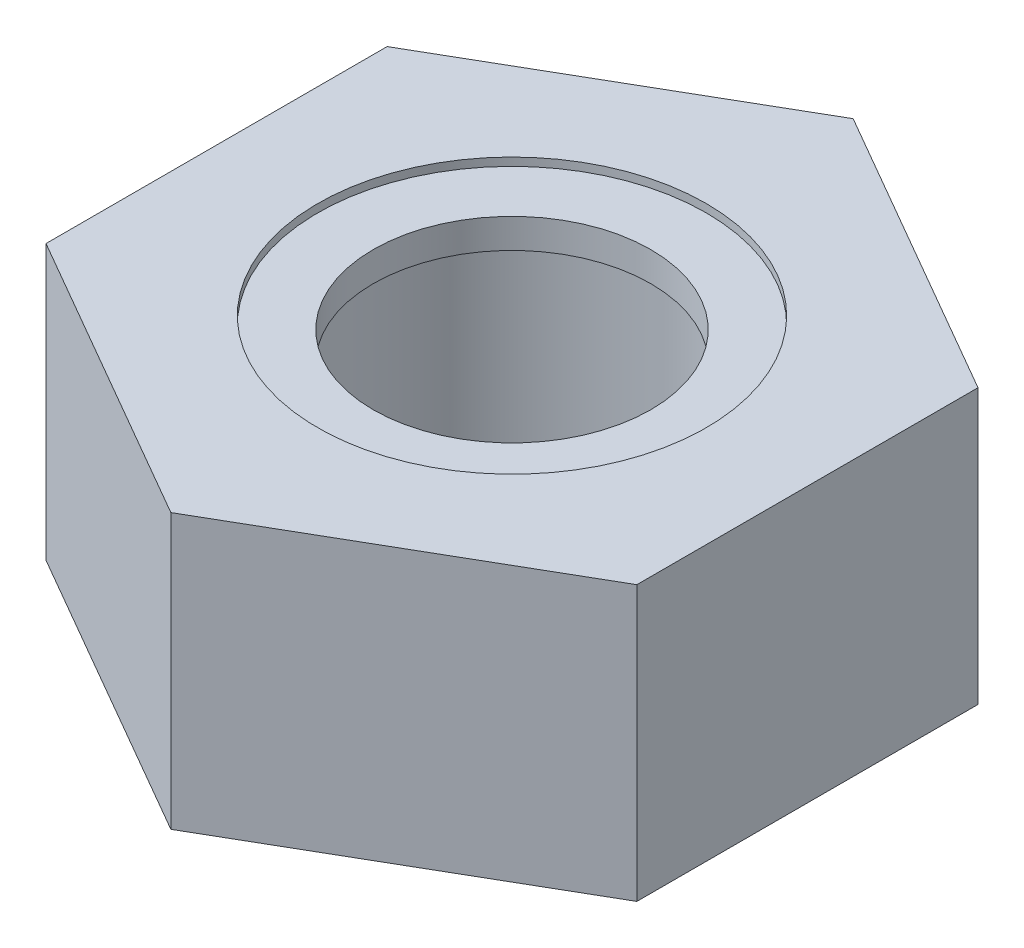
ISO-10303-21;
HEADER;
FILE_DESCRIPTION(('STEP AP214'),'2;1');
FILE_NAME('part.step','',(''),(''),'','','');
FILE_SCHEMA(('AUTOMOTIVE_DESIGN { 1 0 10303 214 1 1 1 1 }'));
ENDSEC;
DATA;
#1=APPLICATION_CONTEXT('core data for automotive mechanical design processes');
#2=APPLICATION_PROTOCOL_DEFINITION('international standard','automotive_design',2000,#1);
#3=PRODUCT_CONTEXT('',#1,'mechanical');
#4=PRODUCT('Part','Part','',(#3));
#5=PRODUCT_RELATED_PRODUCT_CATEGORY('part','',(#4));
#6=PRODUCT_DEFINITION_FORMATION('','',#4);
#7=PRODUCT_DEFINITION_CONTEXT('part definition',#1,'design');
#8=PRODUCT_DEFINITION('design','',#6,#7);
#9=PRODUCT_DEFINITION_SHAPE('','',#8);
#10=(LENGTH_UNIT() NAMED_UNIT(*) SI_UNIT(.MILLI.,.METRE.));
#11=(NAMED_UNIT(*) PLANE_ANGLE_UNIT() SI_UNIT($,.RADIAN.));
#12=(NAMED_UNIT(*) SI_UNIT($,.STERADIAN.) SOLID_ANGLE_UNIT());
#13=UNCERTAINTY_MEASURE_WITH_UNIT(LENGTH_MEASURE(1.E-05),#10,'distance_accuracy_value','');
#14=(GEOMETRIC_REPRESENTATION_CONTEXT(3) GLOBAL_UNCERTAINTY_ASSIGNED_CONTEXT((#13)) GLOBAL_UNIT_ASSIGNED_CONTEXT((#10,
#11,#12)) REPRESENTATION_CONTEXT('',''));
#15=CARTESIAN_POINT('',(0.,0.,0.));
#16=DIRECTION('',(0.,0.,1.));
#17=DIRECTION('',(1.,0.,0.));
#18=AXIS2_PLACEMENT_3D('',#15,#16,#17);
#19=CARTESIAN_POINT('',(0.,4.37567916666667,0.));
#20=DIRECTION('',(0.,-1.,0.));
#21=DIRECTION('',(0.,0.,-1.));
#22=AXIS2_PLACEMENT_3D('',#19,#20,#21);
#23=CYLINDRICAL_SURFACE('',#22,2.60990835569695);
#24=CARTESIAN_POINT('',(0.,4.37567916666667,0.));
#25=DIRECTION('',(0.,-1.,0.));
#26=DIRECTION('',(0.,0.,-1.));
#27=AXIS2_PLACEMENT_3D('',#24,#25,#26);
#28=CIRCLE('',#27,2.60990835569695);
#29=CARTESIAN_POINT('',(0.,4.37567916666667,-2.60990835569695));
#30=VERTEX_POINT('',#29);
#31=EDGE_CURVE('E11',#30,#30,#28,.T.);
#32=ORIENTED_EDGE('',*,*,#31,.T.);
#33=EDGE_LOOP('',(#32));
#34=FACE_BOUND('',#33,.T.);
#35=CARTESIAN_POINT('',(0.,4.930775,0.));
#36=DIRECTION('',(0.,-1.,0.));
#37=DIRECTION('',(0.,0.,-1.));
#38=AXIS2_PLACEMENT_3D('',#35,#36,#37);
#39=CIRCLE('',#38,2.60990835569695);
#40=CARTESIAN_POINT('',(0.,4.930775,-2.60990835569695));
#41=VERTEX_POINT('',#40);
#42=EDGE_CURVE('E59',#41,#41,#39,.T.);
#43=ORIENTED_EDGE('',*,*,#42,.F.);
#44=EDGE_LOOP('',(#43));
#45=FACE_BOUND('',#44,.T.);
#46=ADVANCED_FACE('F45',(#34,#45),#23,.F.);
#47=CARTESIAN_POINT('',(0.,4.37567916666667,-2.60990835569695));
#48=DIRECTION('',(0.,-1.,0.));
#49=DIRECTION('',(0.,0.,-1.));
#50=AXIS2_PLACEMENT_3D('',#47,#48,#49);
#51=PLANE('',#50);
#52=CARTESIAN_POINT('',(0.,4.37567916666666,0.));
#53=DIRECTION('',(0.,-1.,0.));
#54=DIRECTION('',(0.,0.,-1.));
#55=AXIS2_PLACEMENT_3D('',#52,#53,#54);
#56=CIRCLE('',#55,5.32303429973618);
#57=CARTESIAN_POINT('',(0.,4.37567916666667,-5.32303429973618));
#58=VERTEX_POINT('',#57);
#59=EDGE_CURVE('E51',#58,#58,#56,.T.);
#60=ORIENTED_EDGE('',*,*,#59,.T.);
#61=EDGE_LOOP('',(#60));
#62=FACE_BOUND('',#61,.T.);
#63=ORIENTED_EDGE('',*,*,#31,.F.);
#64=EDGE_LOOP('',(#63));
#65=FACE_BOUND('',#64,.T.);
#66=ADVANCED_FACE('F69',(#62,#65),#51,.T.);
#67=CARTESIAN_POINT('',(0.,4.29947916666666,0.));
#68=DIRECTION('',(0.,-1.,0.));
#69=DIRECTION('',(0.,0.,-1.));
#70=AXIS2_PLACEMENT_3D('',#67,#68,#69);
#71=TOROIDAL_SURFACE('',#70,4.69635416666667,0.631295833333333);
#72=CARTESIAN_POINT('',(0.,4.930775,0.));
#73=DIRECTION('',(0.,-1.,0.));
#74=DIRECTION('',(0.,0.,-1.));
#75=AXIS2_PLACEMENT_3D('',#72,#73,#74);
#76=CIRCLE('',#75,4.69635416666667);
#77=CARTESIAN_POINT('',(0.,4.930775,-4.69635416666667));
#78=VERTEX_POINT('',#77);
#79=EDGE_CURVE('E55',#78,#78,#76,.T.);
#80=ORIENTED_EDGE('',*,*,#79,.T.);
#81=EDGE_LOOP('',(#80));
#82=FACE_BOUND('',#81,.T.);
#83=ORIENTED_EDGE('',*,*,#59,.F.);
#84=EDGE_LOOP('',(#83));
#85=FACE_BOUND('',#84,.T.);
#86=ADVANCED_FACE('F73',(#82,#85),#71,.T.);
#87=CARTESIAN_POINT('',(0.,4.930775,-4.69635416666667));
#88=DIRECTION('',(0.,1.,0.));
#89=DIRECTION('',(0.,0.,1.));
#90=AXIS2_PLACEMENT_3D('',#87,#88,#89);
#91=PLANE('',#90);
#92=ORIENTED_EDGE('',*,*,#42,.T.);
#93=EDGE_LOOP('',(#92));
#94=FACE_BOUND('',#93,.T.);
#95=ORIENTED_EDGE('',*,*,#79,.F.);
#96=EDGE_LOOP('',(#95));
#97=FACE_BOUND('',#96,.T.);
#98=ADVANCED_FACE('F65',(#94,#97),#91,.T.);
#99=CLOSED_SHELL('',(#46,#66,#86,#98));
#100=MANIFOLD_SOLID_BREP('B2',#99);
#101=CARTESIAN_POINT('',(5.55625,5.159375,-3.20790243318487));
#102=DIRECTION('',(-0.5,0.,0.866025403784439));
#103=DIRECTION('',(0.866025403784439,0.,0.5));
#104=AXIS2_PLACEMENT_3D('',#101,#102,#103);
#105=PLANE('',#104);
#106=DIRECTION('',(-0.866025403784439,0.,-0.5));
#107=VECTOR('',#106,1.);
#108=CARTESIAN_POINT('',(5.55625,0.,-3.20790243318487));
#109=LINE('',#108,#107);
#110=CARTESIAN_POINT('',(5.55625,0.,-3.20790243318487));
#111=VERTEX_POINT('',#110);
#112=CARTESIAN_POINT('',(0.,0.,-6.41580486636972));
#113=VERTEX_POINT('',#112);
#114=EDGE_CURVE('E193',#111,#113,#109,.T.);
#115=ORIENTED_EDGE('',*,*,#114,.T.);
#116=DIRECTION('',(0.,-1.,0.));
#117=VECTOR('',#116,1.);
#118=CARTESIAN_POINT('',(0.,5.159375,-6.41580486636972));
#119=LINE('',#118,#117);
#120=CARTESIAN_POINT('',(0.,5.159375,-6.41580486636972));
#121=VERTEX_POINT('',#120);
#122=EDGE_CURVE('E43',#121,#113,#119,.T.);
#123=ORIENTED_EDGE('',*,*,#122,.F.);
#124=DIRECTION('',(-0.866025403784439,0.,-0.5));
#125=VECTOR('',#124,1.);
#126=CARTESIAN_POINT('',(5.55625,5.159375,-3.20790243318487));
#127=LINE('',#126,#125);
#128=CARTESIAN_POINT('',(5.55625,5.159375,-3.20790243318487));
#129=VERTEX_POINT('',#128);
#130=EDGE_CURVE('E204',#129,#121,#127,.T.);
#131=ORIENTED_EDGE('',*,*,#130,.F.);
#132=DIRECTION('',(0.,-1.,0.));
#133=VECTOR('',#132,1.);
#134=CARTESIAN_POINT('',(5.55625,5.159375,-3.20790243318487));
#135=LINE('',#134,#133);
#136=EDGE_CURVE('E189',#129,#111,#135,.T.);
#137=ORIENTED_EDGE('',*,*,#136,.T.);
#138=EDGE_LOOP('',(#115,#123,#131,#137));
#139=FACE_BOUND('',#138,.T.);
#140=ADVANCED_FACE('F107',(#139),#105,.F.);
#141=CARTESIAN_POINT('',(0.,5.159375,-6.41580486636972));
#142=DIRECTION('',(0.5,0.,0.866025403784439));
#143=DIRECTION('',(0.866025403784439,0.,-0.5));
#144=AXIS2_PLACEMENT_3D('',#141,#142,#143);
#145=PLANE('',#144);
#146=DIRECTION('',(-0.866025403784439,0.,0.5));
#147=VECTOR('',#146,1.);
#148=CARTESIAN_POINT('',(0.,0.,-6.41580486636972));
#149=LINE('',#148,#147);
#150=CARTESIAN_POINT('',(-5.55625,0.,-3.20790243318487));
#151=VERTEX_POINT('',#150);
#152=EDGE_CURVE('E196',#113,#151,#149,.T.);
#153=ORIENTED_EDGE('',*,*,#152,.T.);
#154=DIRECTION('',(0.,-1.,0.));
#155=VECTOR('',#154,1.);
#156=CARTESIAN_POINT('',(-5.55625,5.159375,-3.20790243318487));
#157=LINE('',#156,#155);
#158=CARTESIAN_POINT('',(-5.55625,5.159375,-3.20790243318487));
#159=VERTEX_POINT('',#158);
#160=EDGE_CURVE('E116',#159,#151,#157,.T.);
#161=ORIENTED_EDGE('',*,*,#160,.F.);
#162=DIRECTION('',(-0.866025403784439,0.,0.5));
#163=VECTOR('',#162,1.);
#164=CARTESIAN_POINT('',(0.,5.159375,-6.41580486636972));
#165=LINE('',#164,#163);
#166=EDGE_CURVE('E162',#121,#159,#165,.T.);
#167=ORIENTED_EDGE('',*,*,#166,.F.);
#168=ORIENTED_EDGE('',*,*,#122,.T.);
#169=EDGE_LOOP('',(#153,#161,#167,#168));
#170=FACE_BOUND('',#169,.T.);
#171=ADVANCED_FACE('F230',(#170),#145,.F.);
#172=CARTESIAN_POINT('',(-5.55625,5.159375,-3.20790243318487));
#173=DIRECTION('',(1.,0.,0.));
#174=DIRECTION('',(0.,0.,-1.));
#175=AXIS2_PLACEMENT_3D('',#172,#173,#174);
#176=PLANE('',#175);
#177=DIRECTION('',(0.,0.,1.));
#178=VECTOR('',#177,1.);
#179=CARTESIAN_POINT('',(-5.55625,0.,-3.20790243318487));
#180=LINE('',#179,#178);
#181=CARTESIAN_POINT('',(-5.55625,0.,3.20790243318485));
#182=VERTEX_POINT('',#181);
#183=EDGE_CURVE('E199',#151,#182,#180,.T.);
#184=ORIENTED_EDGE('',*,*,#183,.T.);
#185=DIRECTION('',(0.,-1.,0.));
#186=VECTOR('',#185,1.);
#187=CARTESIAN_POINT('',(-5.55625,5.159375,3.20790243318485));
#188=LINE('',#187,#186);
#189=CARTESIAN_POINT('',(-5.55625,5.159375,3.20790243318485));
#190=VERTEX_POINT('',#189);
#191=EDGE_CURVE('E184',#190,#182,#188,.T.);
#192=ORIENTED_EDGE('',*,*,#191,.F.);
#193=DIRECTION('',(0.,0.,1.));
#194=VECTOR('',#193,1.);
#195=CARTESIAN_POINT('',(-5.55625,5.159375,-3.20790243318487));
#196=LINE('',#195,#194);
#197=EDGE_CURVE('E175',#159,#190,#196,.T.);
#198=ORIENTED_EDGE('',*,*,#197,.F.);
#199=ORIENTED_EDGE('',*,*,#160,.T.);
#200=EDGE_LOOP('',(#184,#192,#198,#199));
#201=FACE_BOUND('',#200,.T.);
#202=ADVANCED_FACE('F233',(#201),#176,.F.);
#203=CARTESIAN_POINT('',(-5.55625,5.159375,3.20790243318485));
#204=DIRECTION('',(0.5,0.,-0.866025403784439));
#205=DIRECTION('',(-0.866025403784439,0.,-0.5));
#206=AXIS2_PLACEMENT_3D('',#203,#204,#205);
#207=PLANE('',#206);
#208=DIRECTION('',(0.866025403784439,0.,0.5));
#209=VECTOR('',#208,1.);
#210=CARTESIAN_POINT('',(-5.55625,0.,3.20790243318485));
#211=LINE('',#210,#209);
#212=CARTESIAN_POINT('',(0.,0.,6.41580486636971));
#213=VERTEX_POINT('',#212);
#214=EDGE_CURVE('E183',#182,#213,#211,.T.);
#215=ORIENTED_EDGE('',*,*,#214,.T.);
#216=DIRECTION('',(0.,-1.,0.));
#217=VECTOR('',#216,1.);
#218=CARTESIAN_POINT('',(0.,5.159375,6.41580486636971));
#219=LINE('',#218,#217);
#220=CARTESIAN_POINT('',(0.,5.159375,6.41580486636971));
#221=VERTEX_POINT('',#220);
#222=EDGE_CURVE('E180',#221,#213,#219,.T.);
#223=ORIENTED_EDGE('',*,*,#222,.F.);
#224=DIRECTION('',(0.866025403784439,0.,0.5));
#225=VECTOR('',#224,1.);
#226=CARTESIAN_POINT('',(-5.55625,5.159375,3.20790243318485));
#227=LINE('',#226,#225);
#228=EDGE_CURVE('E169',#190,#221,#227,.T.);
#229=ORIENTED_EDGE('',*,*,#228,.F.);
#230=ORIENTED_EDGE('',*,*,#191,.T.);
#231=EDGE_LOOP('',(#215,#223,#229,#230));
#232=FACE_BOUND('',#231,.T.);
#233=ADVANCED_FACE('F181',(#232),#207,.F.);
#234=CARTESIAN_POINT('',(0.,5.159375,6.41580486636971));
#235=DIRECTION('',(-0.5,0.,-0.866025403784439));
#236=DIRECTION('',(-0.866025403784439,0.,0.5));
#237=AXIS2_PLACEMENT_3D('',#234,#235,#236);
#238=PLANE('',#237);
#239=DIRECTION('',(0.866025403784439,0.,-0.5));
#240=VECTOR('',#239,1.);
#241=CARTESIAN_POINT('',(0.,0.,6.41580486636971));
#242=LINE('',#241,#240);
#243=CARTESIAN_POINT('',(5.55625,0.,3.20790243318485));
#244=VERTEX_POINT('',#243);
#245=EDGE_CURVE('E148',#213,#244,#242,.T.);
#246=ORIENTED_EDGE('',*,*,#245,.T.);
#247=DIRECTION('',(0.,-1.,0.));
#248=VECTOR('',#247,1.);
#249=CARTESIAN_POINT('',(5.55625,5.159375,3.20790243318485));
#250=LINE('',#249,#248);
#251=CARTESIAN_POINT('',(5.55625,5.159375,3.20790243318485));
#252=VERTEX_POINT('',#251);
#253=EDGE_CURVE('E185',#252,#244,#250,.T.);
#254=ORIENTED_EDGE('',*,*,#253,.F.);
#255=DIRECTION('',(0.866025403784439,0.,-0.5));
#256=VECTOR('',#255,1.);
#257=CARTESIAN_POINT('',(0.,5.159375,6.41580486636971));
#258=LINE('',#257,#256);
#259=EDGE_CURVE('E173',#221,#252,#258,.T.);
#260=ORIENTED_EDGE('',*,*,#259,.F.);
#261=ORIENTED_EDGE('',*,*,#222,.T.);
#262=EDGE_LOOP('',(#246,#254,#260,#261));
#263=FACE_BOUND('',#262,.T.);
#264=ADVANCED_FACE('F187',(#263),#238,.F.);
#265=CARTESIAN_POINT('',(5.55625,5.159375,3.20790243318485));
#266=DIRECTION('',(-1.,0.,0.));
#267=DIRECTION('',(0.,0.,1.));
#268=AXIS2_PLACEMENT_3D('',#265,#266,#267);
#269=PLANE('',#268);
#270=DIRECTION('',(0.,0.,-1.));
#271=VECTOR('',#270,1.);
#272=CARTESIAN_POINT('',(5.55625,0.,3.20790243318485));
#273=LINE('',#272,#271);
#274=EDGE_CURVE('E154',#244,#111,#273,.T.);
#275=ORIENTED_EDGE('',*,*,#274,.T.);
#276=ORIENTED_EDGE('',*,*,#136,.F.);
#277=DIRECTION('',(0.,0.,-1.));
#278=VECTOR('',#277,1.);
#279=CARTESIAN_POINT('',(5.55625,5.159375,3.20790243318485));
#280=LINE('',#279,#278);
#281=EDGE_CURVE('E125',#252,#129,#280,.T.);
#282=ORIENTED_EDGE('',*,*,#281,.F.);
#283=ORIENTED_EDGE('',*,*,#253,.T.);
#284=EDGE_LOOP('',(#275,#276,#282,#283));
#285=FACE_BOUND('',#284,.T.);
#286=ADVANCED_FACE('F238',(#285),#269,.F.);
#287=CARTESIAN_POINT('',(5.55625,5.159375,-3.20790243318487));
#288=DIRECTION('',(0.,-1.,0.));
#289=DIRECTION('',(0.,0.,-1.));
#290=AXIS2_PLACEMENT_3D('',#287,#288,#289);
#291=PLANE('',#290);
#292=CARTESIAN_POINT('',(0.,5.159375,0.));
#293=DIRECTION('',(0.,-1.,0.));
#294=DIRECTION('',(0.,0.,-1.));
#295=AXIS2_PLACEMENT_3D('',#292,#293,#294);
#296=CIRCLE('',#295,3.65313126118181);
#297=CARTESIAN_POINT('',(0.,5.159375,-3.65313126118181));
#298=VERTEX_POINT('',#297);
#299=EDGE_CURVE('E110',#298,#298,#296,.T.);
#300=ORIENTED_EDGE('',*,*,#299,.T.);
#301=EDGE_LOOP('',(#300));
#302=FACE_BOUND('',#301,.T.);
#303=ORIENTED_EDGE('',*,*,#130,.T.);
#304=ORIENTED_EDGE('',*,*,#166,.T.);
#305=ORIENTED_EDGE('',*,*,#197,.T.);
#306=ORIENTED_EDGE('',*,*,#228,.T.);
#307=ORIENTED_EDGE('',*,*,#259,.T.);
#308=ORIENTED_EDGE('',*,*,#281,.T.);
#309=EDGE_LOOP('',(#303,#304,#305,#306,#307,#308));
#310=FACE_BOUND('',#309,.T.);
#311=ADVANCED_FACE('F171',(#302,#310),#291,.F.);
#312=CARTESIAN_POINT('',(5.55625,0.,-3.20790243318487));
#313=DIRECTION('',(0.,-1.,0.));
#314=DIRECTION('',(0.,0.,-1.));
#315=AXIS2_PLACEMENT_3D('',#312,#313,#314);
#316=PLANE('',#315);
#317=CARTESIAN_POINT('',(0.,0.,0.));
#318=DIRECTION('',(0.,-1.,0.));
#319=DIRECTION('',(0.,0.,-1.));
#320=AXIS2_PLACEMENT_3D('',#317,#318,#319);
#321=CIRCLE('',#320,3.175);
#322=CARTESIAN_POINT('',(0.,0.,-3.175));
#323=VERTEX_POINT('',#322);
#324=EDGE_CURVE('E197',#323,#323,#321,.T.);
#325=ORIENTED_EDGE('',*,*,#324,.F.);
#326=EDGE_LOOP('',(#325));
#327=FACE_BOUND('',#326,.T.);
#328=ORIENTED_EDGE('',*,*,#114,.F.);
#329=ORIENTED_EDGE('',*,*,#274,.F.);
#330=ORIENTED_EDGE('',*,*,#245,.F.);
#331=ORIENTED_EDGE('',*,*,#214,.F.);
#332=ORIENTED_EDGE('',*,*,#183,.F.);
#333=ORIENTED_EDGE('',*,*,#152,.F.);
#334=EDGE_LOOP('',(#328,#329,#330,#331,#332,#333));
#335=FACE_BOUND('',#334,.T.);
#336=ADVANCED_FACE('F236',(#327,#335),#316,.T.);
#337=CARTESIAN_POINT('',(0.,-3.175,0.));
#338=DIRECTION('',(0.,-1.,0.));
#339=DIRECTION('',(0.,0.,-1.));
#340=AXIS2_PLACEMENT_3D('',#337,#338,#339);
#341=CYLINDRICAL_SURFACE('',#340,3.175);
#342=CARTESIAN_POINT('',(0.,4.29947916666667,0.));
#343=DIRECTION('',(0.,-1.,0.));
#344=DIRECTION('',(0.,0.,-1.));
#345=AXIS2_PLACEMENT_3D('',#342,#343,#344);
#346=CIRCLE('',#345,3.175);
#347=CARTESIAN_POINT('',(0.,4.29947916666667,-3.175));
#348=VERTEX_POINT('',#347);
#349=EDGE_CURVE('E209',#348,#348,#346,.F.);
#350=ORIENTED_EDGE('',*,*,#349,.T.);
#351=EDGE_LOOP('',(#350));
#352=FACE_BOUND('',#351,.T.);
#353=ORIENTED_EDGE('',*,*,#324,.T.);
#354=EDGE_LOOP('',(#353));
#355=FACE_BOUND('',#354,.T.);
#356=ADVANCED_FACE('F294',(#352,#355),#341,.F.);
#357=CARTESIAN_POINT('',(0.,6.429375,0.));
#358=DIRECTION('',(0.,-1.,0.));
#359=DIRECTION('',(0.,0.,-1.));
#360=AXIS2_PLACEMENT_3D('',#357,#358,#359);
#361=CYLINDRICAL_SURFACE('',#360,3.65313126118181);
#362=CARTESIAN_POINT('',(0.,5.006975,0.));
#363=DIRECTION('',(0.,-1.,0.));
#364=DIRECTION('',(0.,0.,-1.));
#365=AXIS2_PLACEMENT_3D('',#362,#363,#364);
#366=CIRCLE('',#365,3.65313126118181);
#367=CARTESIAN_POINT('',(0.,5.006975,-3.65313126118181));
#368=VERTEX_POINT('',#367);
#369=EDGE_CURVE('E221',#368,#368,#366,.T.);
#370=ORIENTED_EDGE('',*,*,#369,.T.);
#371=EDGE_LOOP('',(#370));
#372=FACE_BOUND('',#371,.T.);
#373=ORIENTED_EDGE('',*,*,#299,.F.);
#374=EDGE_LOOP('',(#373));
#375=FACE_BOUND('',#374,.T.);
#376=ADVANCED_FACE('F306',(#372,#375),#361,.F.);
#377=CARTESIAN_POINT('',(0.,4.29947916666667,0.));
#378=DIRECTION('',(0.,-1.,0.));
#379=DIRECTION('',(0.,0.,-1.));
#380=AXIS2_PLACEMENT_3D('',#377,#378,#379);
#381=PLANE('',#380);
#382=CARTESIAN_POINT('',(0.,4.29947916666667,0.));
#383=DIRECTION('',(0.,-1.,0.));
#384=DIRECTION('',(0.,0.,-1.));
#385=AXIS2_PLACEMENT_3D('',#382,#383,#384);
#386=CIRCLE('',#385,5.40385);
#387=CARTESIAN_POINT('',(0.,4.29947916666667,-5.40385));
#388=VERTEX_POINT('',#387);
#389=EDGE_CURVE('E211',#388,#388,#386,.T.);
#390=ORIENTED_EDGE('',*,*,#389,.F.);
#391=EDGE_LOOP('',(#390));
#392=FACE_BOUND('',#391,.T.);
#393=ORIENTED_EDGE('',*,*,#349,.F.);
#394=EDGE_LOOP('',(#393));
#395=FACE_BOUND('',#394,.T.);
#396=ADVANCED_FACE('F313',(#392,#395),#381,.F.);
#397=CARTESIAN_POINT('',(0.,4.29947916666667,0.));
#398=DIRECTION('',(0.,-1.,0.));
#399=DIRECTION('',(0.,0.,-1.));
#400=AXIS2_PLACEMENT_3D('',#397,#398,#399);
#401=TOROIDAL_SURFACE('',#400,4.69635416666666,0.707495833333332);
#402=CARTESIAN_POINT('',(0.,5.006975,0.));
#403=DIRECTION('',(0.,-1.,0.));
#404=DIRECTION('',(0.,0.,-1.));
#405=AXIS2_PLACEMENT_3D('',#402,#403,#404);
#406=CIRCLE('',#405,4.69635416666666);
#407=CARTESIAN_POINT('',(0.,5.006975,-4.69635416666667));
#408=VERTEX_POINT('',#407);
#409=EDGE_CURVE('E216',#408,#408,#406,.T.);
#410=ORIENTED_EDGE('',*,*,#409,.F.);
#411=EDGE_LOOP('',(#410));
#412=FACE_BOUND('',#411,.T.);
#413=ORIENTED_EDGE('',*,*,#389,.T.);
#414=EDGE_LOOP('',(#413));
#415=FACE_BOUND('',#414,.T.);
#416=ADVANCED_FACE('F323',(#412,#415),#401,.F.);
#417=CARTESIAN_POINT('',(0.,5.006975,-4.69635416666667));
#418=DIRECTION('',(0.,1.,0.));
#419=DIRECTION('',(0.,0.,1.));
#420=AXIS2_PLACEMENT_3D('',#417,#418,#419);
#421=PLANE('',#420);
#422=ORIENTED_EDGE('',*,*,#369,.F.);
#423=EDGE_LOOP('',(#422));
#424=FACE_BOUND('',#423,.T.);
#425=ORIENTED_EDGE('',*,*,#409,.T.);
#426=EDGE_LOOP('',(#425));
#427=FACE_BOUND('',#426,.T.);
#428=ADVANCED_FACE('F333',(#424,#427),#421,.F.);
#429=CLOSED_SHELL('',(#140,#171,#202,#233,#264,#286,#311,#336,#356,#376,#396,#416,#428));
#430=MANIFOLD_SOLID_BREP('B6',#429);
#431=ADVANCED_BREP_SHAPE_REPRESENTATION('',(#18,#100,#430),#14);
#432=SHAPE_DEFINITION_REPRESENTATION(#9,#431);
ENDSEC;
END-ISO-10303-21;
